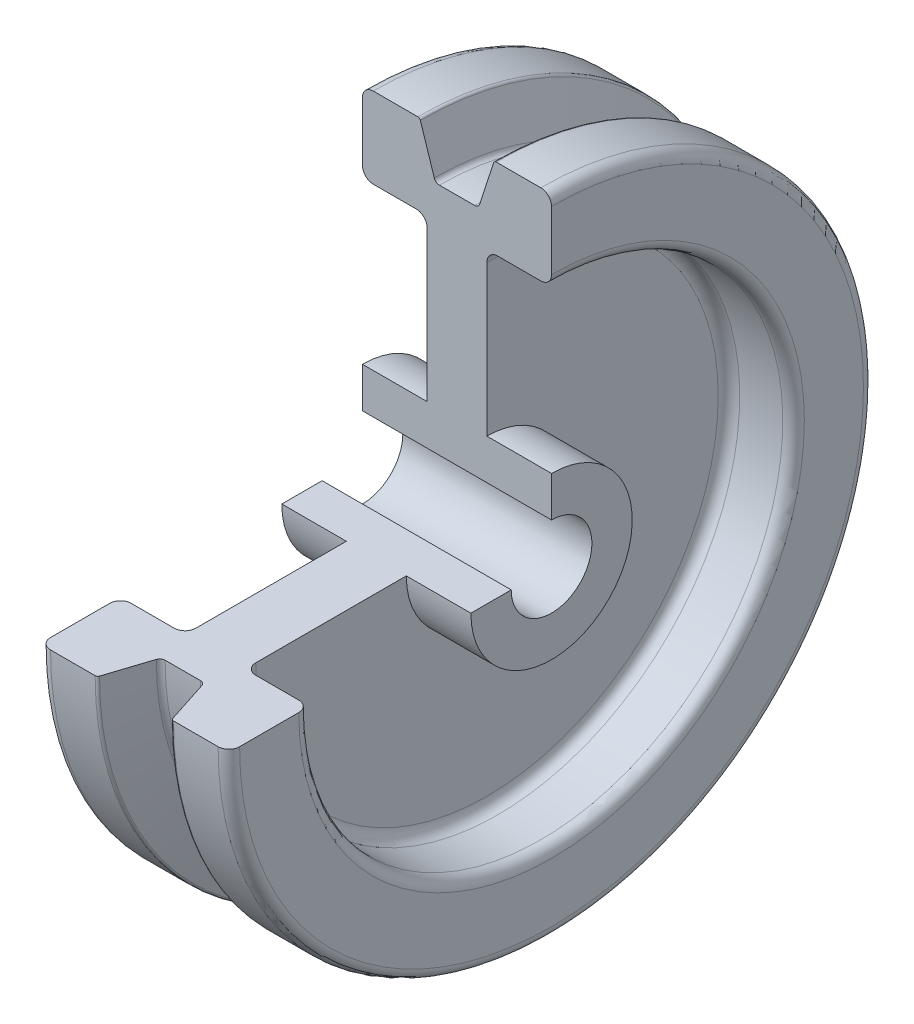
ISO-10303-21;
HEADER;
FILE_DESCRIPTION(('STEP AP214'),'2;1');
FILE_NAME('part.step','',(''),(''),'','','');
FILE_SCHEMA(('AUTOMOTIVE_DESIGN { 1 0 10303 214 1 1 1 1 }'));
ENDSEC;
DATA;
#1=APPLICATION_CONTEXT('core data for automotive mechanical design processes');
#2=APPLICATION_PROTOCOL_DEFINITION('international standard','automotive_design',2000,#1);
#3=PRODUCT_CONTEXT('',#1,'mechanical');
#4=PRODUCT('Part','Part','',(#3));
#5=PRODUCT_RELATED_PRODUCT_CATEGORY('part','',(#4));
#6=PRODUCT_DEFINITION_FORMATION('','',#4);
#7=PRODUCT_DEFINITION_CONTEXT('part definition',#1,'design');
#8=PRODUCT_DEFINITION('design','',#6,#7);
#9=PRODUCT_DEFINITION_SHAPE('','',#8);
#10=(LENGTH_UNIT() NAMED_UNIT(*) SI_UNIT(.MILLI.,.METRE.));
#11=(NAMED_UNIT(*) PLANE_ANGLE_UNIT() SI_UNIT($,.RADIAN.));
#12=(NAMED_UNIT(*) SI_UNIT($,.STERADIAN.) SOLID_ANGLE_UNIT());
#13=UNCERTAINTY_MEASURE_WITH_UNIT(LENGTH_MEASURE(1.E-05),#10,'distance_accuracy_value','');
#14=(GEOMETRIC_REPRESENTATION_CONTEXT(3) GLOBAL_UNCERTAINTY_ASSIGNED_CONTEXT((#13)) GLOBAL_UNIT_ASSIGNED_CONTEXT((#10,
#11,#12)) REPRESENTATION_CONTEXT('',''));
#15=CARTESIAN_POINT('',(0.,0.,0.));
#16=DIRECTION('',(0.,0.,1.));
#17=DIRECTION('',(1.,0.,0.));
#18=AXIS2_PLACEMENT_3D('',#15,#16,#17);
#19=CARTESIAN_POINT('',(-22.8146013448606,0.,0.));
#20=DIRECTION('',(-1.,0.,0.));
#21=DIRECTION('',(0.,0.,1.));
#22=AXIS2_PLACEMENT_3D('',#19,#20,#21);
#23=CYLINDRICAL_SURFACE('',#22,7.5);
#24=DIRECTION('',(-1.,0.,0.));
#25=VECTOR('',#24,1.);
#26=CARTESIAN_POINT('',(-22.8146013448606,7.5,0.));
#27=LINE('',#26,#25);
#28=CARTESIAN_POINT('',(-14.7231594525405,7.5,0.));
#29=VERTEX_POINT('',#28);
#30=CARTESIAN_POINT('',(20.4353419883816,7.50000000000001,0.));
#31=VERTEX_POINT('',#30);
#32=EDGE_CURVE('E349',#29,#31,#27,.F.);
#33=ORIENTED_EDGE('',*,*,#32,.F.);
#34=CARTESIAN_POINT('',(-14.7231594525405,0.,0.));
#35=DIRECTION('',(-1.,0.,0.));
#36=DIRECTION('',(0.,0.,1.));
#37=AXIS2_PLACEMENT_3D('',#34,#35,#36);
#38=CIRCLE('',#37,7.5);
#39=CARTESIAN_POINT('',(-14.7231594525405,0.,7.5));
#40=VERTEX_POINT('',#39);
#41=EDGE_CURVE('E396',#29,#40,#38,.T.);
#42=ORIENTED_EDGE('',*,*,#41,.T.);
#43=DIRECTION('',(-1.,0.,0.));
#44=VECTOR('',#43,1.);
#45=CARTESIAN_POINT('',(-22.8146013448606,0.,7.5));
#46=LINE('',#45,#44);
#47=CARTESIAN_POINT('',(20.4353419883816,0.,7.49999999999999));
#48=VERTEX_POINT('',#47);
#49=EDGE_CURVE('E517',#40,#48,#46,.F.);
#50=ORIENTED_EDGE('',*,*,#49,.T.);
#51=CARTESIAN_POINT('',(20.4353419883816,0.,0.));
#52=DIRECTION('',(-1.,0.,0.));
#53=DIRECTION('',(0.,0.,1.));
#54=AXIS2_PLACEMENT_3D('',#51,#52,#53);
#55=CIRCLE('',#54,7.5);
#56=EDGE_CURVE('E408',#31,#48,#55,.T.);
#57=ORIENTED_EDGE('',*,*,#56,.F.);
#58=EDGE_LOOP('',(#33,#42,#50,#57));
#59=FACE_BOUND('',#58,.T.);
#60=ADVANCED_FACE('F39',(#59),#23,.F.);
#61=CARTESIAN_POINT('',(20.4353419883816,7.5,0.));
#62=DIRECTION('',(-1.,0.,0.));
#63=DIRECTION('',(0.,0.,1.));
#64=AXIS2_PLACEMENT_3D('',#61,#62,#63);
#65=PLANE('',#64);
#66=DIRECTION('',(0.,-1.,0.));
#67=VECTOR('',#66,1.);
#68=CARTESIAN_POINT('',(20.4353419883816,70.,0.));
#69=LINE('',#68,#67);
#70=CARTESIAN_POINT('',(20.4353419883816,15.,0.));
#71=VERTEX_POINT('',#70);
#72=EDGE_CURVE('E237',#71,#31,#69,.T.);
#73=ORIENTED_EDGE('',*,*,#72,.T.);
#74=ORIENTED_EDGE('',*,*,#56,.T.);
#75=DIRECTION('',(0.,0.,-1.));
#76=VECTOR('',#75,1.);
#77=CARTESIAN_POINT('',(20.4353419883816,0.,70.));
#78=LINE('',#77,#76);
#79=CARTESIAN_POINT('',(20.4353419883816,0.,15.));
#80=VERTEX_POINT('',#79);
#81=EDGE_CURVE('E238',#80,#48,#78,.T.);
#82=ORIENTED_EDGE('',*,*,#81,.F.);
#83=CARTESIAN_POINT('',(20.4353419883816,0.,0.));
#84=DIRECTION('',(-1.,0.,0.));
#85=DIRECTION('',(0.,0.,1.));
#86=AXIS2_PLACEMENT_3D('',#83,#84,#85);
#87=CIRCLE('',#86,15.);
#88=EDGE_CURVE('E404',#71,#80,#87,.T.);
#89=ORIENTED_EDGE('',*,*,#88,.F.);
#90=EDGE_LOOP('',(#73,#74,#82,#89));
#91=FACE_BOUND('',#90,.T.);
#92=ADVANCED_FACE('F541',(#91),#65,.F.);
#93=CARTESIAN_POINT('',(-22.8146013448606,0.,0.));
#94=DIRECTION('',(-1.,0.,0.));
#95=DIRECTION('',(0.,0.,1.));
#96=AXIS2_PLACEMENT_3D('',#93,#94,#95);
#97=CYLINDRICAL_SURFACE('',#96,15.);
#98=DIRECTION('',(-1.,0.,0.));
#99=VECTOR('',#98,1.);
#100=CARTESIAN_POINT('',(-22.8146013448606,15.,0.));
#101=LINE('',#100,#99);
#102=CARTESIAN_POINT('',(8.42765707003392,15.,0.));
#103=VERTEX_POINT('',#102);
#104=EDGE_CURVE('E387',#71,#103,#101,.T.);
#105=ORIENTED_EDGE('',*,*,#104,.F.);
#106=ORIENTED_EDGE('',*,*,#88,.T.);
#107=DIRECTION('',(-1.,0.,0.));
#108=VECTOR('',#107,1.);
#109=CARTESIAN_POINT('',(-22.8146013448606,0.,15.));
#110=LINE('',#109,#108);
#111=CARTESIAN_POINT('',(8.42765707003392,0.,15.));
#112=VERTEX_POINT('',#111);
#113=EDGE_CURVE('E485',#80,#112,#110,.T.);
#114=ORIENTED_EDGE('',*,*,#113,.T.);
#115=CARTESIAN_POINT('',(8.42765707003392,0.,0.));
#116=DIRECTION('',(-1.,0.,0.));
#117=DIRECTION('',(0.,0.,1.));
#118=AXIS2_PLACEMENT_3D('',#115,#116,#117);
#119=CIRCLE('',#118,15.);
#120=EDGE_CURVE('E400',#103,#112,#119,.T.);
#121=ORIENTED_EDGE('',*,*,#120,.F.);
#122=EDGE_LOOP('',(#105,#106,#114,#121));
#123=FACE_BOUND('',#122,.T.);
#124=ADVANCED_FACE('F547',(#123),#97,.T.);
#125=CARTESIAN_POINT('',(8.42765707003392,15.,0.));
#126=DIRECTION('',(-1.,0.,0.));
#127=DIRECTION('',(0.,0.,1.));
#128=AXIS2_PLACEMENT_3D('',#125,#126,#127);
#129=PLANE('',#128);
#130=DIRECTION('',(0.,0.,1.));
#131=VECTOR('',#130,1.);
#132=CARTESIAN_POINT('',(8.42765707003392,0.,0.));
#133=LINE('',#132,#131);
#134=CARTESIAN_POINT('',(8.42765707003392,0.,43.));
#135=VERTEX_POINT('',#134);
#136=EDGE_CURVE('E481',#112,#135,#133,.T.);
#137=ORIENTED_EDGE('',*,*,#136,.T.);
#138=CARTESIAN_POINT('',(8.42765707003392,0.,0.));
#139=DIRECTION('',(-1.,0.,0.));
#140=DIRECTION('',(0.,0.,1.));
#141=AXIS2_PLACEMENT_3D('',#138,#139,#140);
#142=CIRCLE('',#141,43.);
#143=CARTESIAN_POINT('',(8.42765707003392,43.,0.));
#144=VERTEX_POINT('',#143);
#145=EDGE_CURVE('E273',#135,#144,#142,.F.);
#146=ORIENTED_EDGE('',*,*,#145,.T.);
#147=DIRECTION('',(0.,1.,0.));
#148=VECTOR('',#147,1.);
#149=CARTESIAN_POINT('',(8.42765707003392,15.,0.));
#150=LINE('',#149,#148);
#151=EDGE_CURVE('E383',#103,#144,#150,.T.);
#152=ORIENTED_EDGE('',*,*,#151,.F.);
#153=ORIENTED_EDGE('',*,*,#120,.T.);
#154=EDGE_LOOP('',(#137,#146,#152,#153));
#155=FACE_BOUND('',#154,.T.);
#156=ADVANCED_FACE('F581',(#155),#129,.F.);
#157=CARTESIAN_POINT('',(-22.8146013448606,0.,0.));
#158=DIRECTION('',(-1.,0.,0.));
#159=DIRECTION('',(0.,0.,1.));
#160=AXIS2_PLACEMENT_3D('',#157,#158,#159);
#161=CYLINDRICAL_SURFACE('',#160,45.);
#162=DIRECTION('',(-1.,0.,0.));
#163=VECTOR('',#162,1.);
#164=CARTESIAN_POINT('',(-22.8146013448606,45.,0.));
#165=LINE('',#164,#163);
#166=CARTESIAN_POINT('',(10.4276570700339,45.,0.));
#167=VERTEX_POINT('',#166);
#168=CARTESIAN_POINT('',(18.4353419883816,45.,0.));
#169=VERTEX_POINT('',#168);
#170=EDGE_CURVE('E380',#167,#169,#165,.F.);
#171=ORIENTED_EDGE('',*,*,#170,.F.);
#172=CARTESIAN_POINT('',(10.4276570700339,0.,0.));
#173=DIRECTION('',(-1.,0.,0.));
#174=DIRECTION('',(0.,0.,1.));
#175=AXIS2_PLACEMENT_3D('',#172,#173,#174);
#176=CIRCLE('',#175,45.);
#177=CARTESIAN_POINT('',(10.4276570700339,0.,45.));
#178=VERTEX_POINT('',#177);
#179=EDGE_CURVE('E269',#167,#178,#176,.T.);
#180=ORIENTED_EDGE('',*,*,#179,.T.);
#181=DIRECTION('',(-1.,0.,0.));
#182=VECTOR('',#181,1.);
#183=CARTESIAN_POINT('',(-22.8146013448606,0.,45.));
#184=LINE('',#183,#182);
#185=CARTESIAN_POINT('',(18.4353419883816,0.,45.));
#186=VERTEX_POINT('',#185);
#187=EDGE_CURVE('E227',#178,#186,#184,.F.);
#188=ORIENTED_EDGE('',*,*,#187,.T.);
#189=CARTESIAN_POINT('',(18.4353419883816,0.,0.));
#190=DIRECTION('',(-1.,0.,0.));
#191=DIRECTION('',(0.,0.,1.));
#192=AXIS2_PLACEMENT_3D('',#189,#190,#191);
#193=CIRCLE('',#192,45.);
#194=EDGE_CURVE('E266',#186,#169,#193,.F.);
#195=ORIENTED_EDGE('',*,*,#194,.T.);
#196=EDGE_LOOP('',(#171,#180,#188,#195));
#197=FACE_BOUND('',#196,.T.);
#198=ADVANCED_FACE('F586',(#197),#161,.F.);
#199=CARTESIAN_POINT('',(20.4353419883816,45.,0.));
#200=DIRECTION('',(-1.,0.,0.));
#201=DIRECTION('',(0.,0.,1.));
#202=AXIS2_PLACEMENT_3D('',#199,#200,#201);
#203=PLANE('',#202);
#204=CARTESIAN_POINT('',(20.4353419883816,58.,0.));
#205=VERTEX_POINT('',#204);
#206=CARTESIAN_POINT('',(20.4353419883816,47.,0.));
#207=VERTEX_POINT('',#206);
#208=EDGE_CURVE('E503',#205,#207,#69,.T.);
#209=ORIENTED_EDGE('',*,*,#208,.T.);
#210=CARTESIAN_POINT('',(20.4353419883816,0.,0.));
#211=DIRECTION('',(-1.,0.,0.));
#212=DIRECTION('',(0.,0.,1.));
#213=AXIS2_PLACEMENT_3D('',#210,#211,#212);
#214=CIRCLE('',#213,47.);
#215=CARTESIAN_POINT('',(20.4353419883816,0.,47.));
#216=VERTEX_POINT('',#215);
#217=EDGE_CURVE('E235',#207,#216,#214,.T.);
#218=ORIENTED_EDGE('',*,*,#217,.T.);
#219=CARTESIAN_POINT('',(20.4353419883816,0.,58.));
#220=VERTEX_POINT('',#219);
#221=EDGE_CURVE('E219',#220,#216,#78,.T.);
#222=ORIENTED_EDGE('',*,*,#221,.F.);
#223=CARTESIAN_POINT('',(20.4353419883816,0.,0.));
#224=DIRECTION('',(-1.,0.,0.));
#225=DIRECTION('',(0.,0.,1.));
#226=AXIS2_PLACEMENT_3D('',#223,#224,#225);
#227=CIRCLE('',#226,58.);
#228=EDGE_CURVE('E233',#220,#205,#227,.F.);
#229=ORIENTED_EDGE('',*,*,#228,.T.);
#230=EDGE_LOOP('',(#209,#218,#222,#229));
#231=FACE_BOUND('',#230,.T.);
#232=ADVANCED_FACE('F232',(#231),#203,.F.);
#233=CARTESIAN_POINT('',(-22.8146013448606,0.,0.));
#234=DIRECTION('',(-1.,0.,0.));
#235=DIRECTION('',(0.,0.,1.));
#236=AXIS2_PLACEMENT_3D('',#233,#234,#235);
#237=CYLINDRICAL_SURFACE('',#236,60.);
#238=DIRECTION('',(-1.,0.,0.));
#239=VECTOR('',#238,1.);
#240=CARTESIAN_POINT('',(-22.8146013448606,60.,0.));
#241=LINE('',#240,#239);
#242=CARTESIAN_POINT('',(18.4353419883816,60.,0.));
#243=VERTEX_POINT('',#242);
#244=CARTESIAN_POINT('',(10.1436397980194,60.,0.));
#245=VERTEX_POINT('',#244);
#246=EDGE_CURVE('E375',#243,#245,#241,.T.);
#247=ORIENTED_EDGE('',*,*,#246,.F.);
#248=CARTESIAN_POINT('',(18.4353419883816,0.,0.));
#249=DIRECTION('',(-1.,0.,0.));
#250=DIRECTION('',(0.,0.,1.));
#251=AXIS2_PLACEMENT_3D('',#248,#249,#250);
#252=CIRCLE('',#251,60.);
#253=CARTESIAN_POINT('',(18.4353419883816,0.,60.));
#254=VERTEX_POINT('',#253);
#255=EDGE_CURVE('E245',#243,#254,#252,.T.);
#256=ORIENTED_EDGE('',*,*,#255,.T.);
#257=DIRECTION('',(-1.,0.,0.));
#258=VECTOR('',#257,1.);
#259=CARTESIAN_POINT('',(-22.8146013448606,0.,60.));
#260=LINE('',#259,#258);
#261=CARTESIAN_POINT('',(10.1436397980194,0.,60.));
#262=VERTEX_POINT('',#261);
#263=EDGE_CURVE('E221',#254,#262,#260,.T.);
#264=ORIENTED_EDGE('',*,*,#263,.T.);
#265=CARTESIAN_POINT('',(10.1436397980194,0.,0.));
#266=DIRECTION('',(1.,0.,0.));
#267=DIRECTION('',(0.,0.,-1.));
#268=AXIS2_PLACEMENT_3D('',#265,#266,#267);
#269=CIRCLE('',#268,60.);
#270=EDGE_CURVE('E416',#262,#245,#269,.T.);
#271=ORIENTED_EDGE('',*,*,#270,.T.);
#272=EDGE_LOOP('',(#247,#256,#264,#271));
#273=FACE_BOUND('',#272,.T.);
#274=ADVANCED_FACE('F607',(#273),#237,.T.);
#275=CARTESIAN_POINT('',(9.78036853401674,0.,0.));
#276=DIRECTION('',(1.,0.,0.));
#277=DIRECTION('',(0.,0.,-1.));
#278=AXIS2_PLACEMENT_3D('',#275,#276,#277);
#279=CONICAL_SURFACE('',#278,60.,1.25663706143592);
#280=DIRECTION('',(-0.309016994374948,-0.951056516295153,0.));
#281=VECTOR('',#280,1.);
#282=CARTESIAN_POINT('',(-9.71481323995767,0.,0.));
#283=LINE('',#282,#281);
#284=CARTESIAN_POINT('',(9.66811153987185,59.6545084971875,0.));
#285=VERTEX_POINT('',#284);
#286=CARTESIAN_POINT('',(7.08060525621038,51.690983005625,0.));
#287=VERTEX_POINT('',#286);
#288=EDGE_CURVE('E368',#285,#287,#283,.T.);
#289=ORIENTED_EDGE('',*,*,#288,.F.);
#290=CARTESIAN_POINT('',(9.66811153987185,0.,0.));
#291=DIRECTION('',(-1.,0.,0.));
#292=DIRECTION('',(0.,0.,1.));
#293=AXIS2_PLACEMENT_3D('',#290,#291,#292);
#294=CIRCLE('',#293,59.6545084971875);
#295=CARTESIAN_POINT('',(9.66811153987185,0.,59.6545084971875));
#296=VERTEX_POINT('',#295);
#297=EDGE_CURVE('E412',#285,#296,#294,.T.);
#298=ORIENTED_EDGE('',*,*,#297,.T.);
#299=DIRECTION('',(-0.309016994374948,0.,-0.951056516295153));
#300=VECTOR('',#299,1.);
#301=CARTESIAN_POINT('',(-9.71481323995767,0.,0.));
#302=LINE('',#301,#300);
#303=CARTESIAN_POINT('',(7.08060525621038,0.,51.690983005625));
#304=VERTEX_POINT('',#303);
#305=EDGE_CURVE('E469',#296,#304,#302,.T.);
#306=ORIENTED_EDGE('',*,*,#305,.T.);
#307=CARTESIAN_POINT('',(7.08060525621038,0.,0.));
#308=DIRECTION('',(1.,0.,0.));
#309=DIRECTION('',(0.,0.,-1.));
#310=AXIS2_PLACEMENT_3D('',#307,#308,#309);
#311=CIRCLE('',#310,51.690983005625);
#312=EDGE_CURVE('E436',#304,#287,#311,.T.);
#313=ORIENTED_EDGE('',*,*,#312,.T.);
#314=EDGE_LOOP('',(#289,#298,#306,#313));
#315=FACE_BOUND('',#314,.T.);
#316=ADVANCED_FACE('F714',(#315),#279,.T.);
#317=CARTESIAN_POINT('',(-22.8146013448606,0.,0.));
#318=DIRECTION('',(-1.,0.,0.));
#319=DIRECTION('',(0.,0.,1.));
#320=AXIS2_PLACEMENT_3D('',#317,#318,#319);
#321=CYLINDRICAL_SURFACE('',#320,51.);
#322=DIRECTION('',(-1.,0.,0.));
#323=VECTOR('',#322,1.);
#324=CARTESIAN_POINT('',(-22.8146013448606,51.,0.));
#325=LINE('',#324,#323);
#326=CARTESIAN_POINT('',(6.12954873991522,51.,0.));
#327=VERTEX_POINT('',#326);
#328=CARTESIAN_POINT('',(-0.417366204074055,51.,0.));
#329=VERTEX_POINT('',#328);
#330=EDGE_CURVE('E362',#327,#329,#325,.T.);
#331=ORIENTED_EDGE('',*,*,#330,.F.);
#332=CARTESIAN_POINT('',(6.12954873991522,0.,0.));
#333=DIRECTION('',(-1.,0.,0.));
#334=DIRECTION('',(0.,0.,1.));
#335=AXIS2_PLACEMENT_3D('',#332,#333,#334);
#336=CIRCLE('',#335,51.);
#337=CARTESIAN_POINT('',(6.12954873991522,0.,51.));
#338=VERTEX_POINT('',#337);
#339=EDGE_CURVE('E432',#327,#338,#336,.T.);
#340=ORIENTED_EDGE('',*,*,#339,.T.);
#341=DIRECTION('',(-1.,0.,0.));
#342=VECTOR('',#341,1.);
#343=CARTESIAN_POINT('',(-22.8146013448606,0.,51.));
#344=LINE('',#343,#342);
#345=CARTESIAN_POINT('',(-0.417366204074055,0.,51.));
#346=VERTEX_POINT('',#345);
#347=EDGE_CURVE('E456',#338,#346,#344,.T.);
#348=ORIENTED_EDGE('',*,*,#347,.T.);
#349=CARTESIAN_POINT('',(-0.417366204074055,0.,0.));
#350=DIRECTION('',(-1.,0.,0.));
#351=DIRECTION('',(0.,0.,1.));
#352=AXIS2_PLACEMENT_3D('',#349,#350,#351);
#353=CIRCLE('',#352,51.);
#354=EDGE_CURVE('E428',#346,#329,#353,.F.);
#355=ORIENTED_EDGE('',*,*,#354,.T.);
#356=EDGE_LOOP('',(#331,#340,#348,#355));
#357=FACE_BOUND('',#356,.T.);
#358=ADVANCED_FACE('F719',(#357),#321,.T.);
#359=CARTESIAN_POINT('',(-14.7231594525405,7.5,0.));
#360=DIRECTION('',(1.,0.,0.));
#361=DIRECTION('',(0.,0.,1.));
#362=AXIS2_PLACEMENT_3D('',#359,#360,#361);
#363=PLANE('',#362);
#364=DIRECTION('',(0.,-1.,0.));
#365=VECTOR('',#364,1.);
#366=CARTESIAN_POINT('',(-14.7231594525405,7.5,0.));
#367=LINE('',#366,#365);
#368=CARTESIAN_POINT('',(-14.7231594525405,15.,0.));
#369=VERTEX_POINT('',#368);
#370=EDGE_CURVE('E341',#369,#29,#367,.T.);
#371=ORIENTED_EDGE('',*,*,#370,.F.);
#372=CARTESIAN_POINT('',(-14.7231594525405,0.,0.));
#373=DIRECTION('',(-1.,0.,0.));
#374=DIRECTION('',(0.,0.,1.));
#375=AXIS2_PLACEMENT_3D('',#372,#373,#374);
#376=CIRCLE('',#375,15.);
#377=CARTESIAN_POINT('',(-14.7231594525405,0.,15.));
#378=VERTEX_POINT('',#377);
#379=EDGE_CURVE('E392',#369,#378,#376,.T.);
#380=ORIENTED_EDGE('',*,*,#379,.T.);
#381=DIRECTION('',(0.,0.,-1.));
#382=VECTOR('',#381,1.);
#383=CARTESIAN_POINT('',(-14.7231594525405,0.,0.));
#384=LINE('',#383,#382);
#385=EDGE_CURVE('E513',#378,#40,#384,.T.);
#386=ORIENTED_EDGE('',*,*,#385,.T.);
#387=ORIENTED_EDGE('',*,*,#41,.F.);
#388=EDGE_LOOP('',(#371,#380,#386,#387));
#389=FACE_BOUND('',#388,.T.);
#390=ADVANCED_FACE('F721',(#389),#363,.F.);
#391=CARTESIAN_POINT('',(28.5267838807018,0.,0.));
#392=DIRECTION('',(1.,0.,0.));
#393=DIRECTION('',(0.,0.,1.));
#394=AXIS2_PLACEMENT_3D('',#391,#392,#393);
#395=CYLINDRICAL_SURFACE('',#394,15.);
#396=DIRECTION('',(1.,0.,0.));
#397=VECTOR('',#396,1.);
#398=CARTESIAN_POINT('',(28.5267838807018,15.,0.));
#399=LINE('',#398,#397);
#400=CARTESIAN_POINT('',(-2.71547453419275,15.,0.));
#401=VERTEX_POINT('',#400);
#402=EDGE_CURVE('E337',#401,#369,#399,.F.);
#403=ORIENTED_EDGE('',*,*,#402,.F.);
#404=CARTESIAN_POINT('',(-2.71547453419275,0.,0.));
#405=DIRECTION('',(-1.,0.,0.));
#406=DIRECTION('',(0.,0.,1.));
#407=AXIS2_PLACEMENT_3D('',#404,#405,#406);
#408=CIRCLE('',#407,15.);
#409=CARTESIAN_POINT('',(-2.71547453419275,0.,15.));
#410=VERTEX_POINT('',#409);
#411=EDGE_CURVE('E335',#401,#410,#408,.T.);
#412=ORIENTED_EDGE('',*,*,#411,.T.);
#413=DIRECTION('',(1.,0.,0.));
#414=VECTOR('',#413,1.);
#415=CARTESIAN_POINT('',(28.5267838807018,0.,15.));
#416=LINE('',#415,#414);
#417=EDGE_CURVE('E509',#410,#378,#416,.F.);
#418=ORIENTED_EDGE('',*,*,#417,.T.);
#419=ORIENTED_EDGE('',*,*,#379,.F.);
#420=EDGE_LOOP('',(#403,#412,#418,#419));
#421=FACE_BOUND('',#420,.T.);
#422=ADVANCED_FACE('F618',(#421),#395,.T.);
#423=CARTESIAN_POINT('',(-2.71547453419275,15.,0.));
#424=DIRECTION('',(1.,0.,0.));
#425=DIRECTION('',(0.,0.,1.));
#426=AXIS2_PLACEMENT_3D('',#423,#424,#425);
#427=PLANE('',#426);
#428=DIRECTION('',(0.,-1.,0.));
#429=VECTOR('',#428,1.);
#430=CARTESIAN_POINT('',(-2.71547453419275,15.,0.));
#431=LINE('',#430,#429);
#432=CARTESIAN_POINT('',(-2.71547453419275,43.,0.));
#433=VERTEX_POINT('',#432);
#434=EDGE_CURVE('E328',#433,#401,#431,.T.);
#435=ORIENTED_EDGE('',*,*,#434,.F.);
#436=CARTESIAN_POINT('',(-2.71547453419275,0.,0.));
#437=DIRECTION('',(1.,0.,0.));
#438=DIRECTION('',(0.,0.,-1.));
#439=AXIS2_PLACEMENT_3D('',#436,#437,#438);
#440=CIRCLE('',#439,43.);
#441=CARTESIAN_POINT('',(-2.71547453419275,0.,43.));
#442=VERTEX_POINT('',#441);
#443=EDGE_CURVE('E276',#433,#442,#440,.F.);
#444=ORIENTED_EDGE('',*,*,#443,.T.);
#445=DIRECTION('',(0.,0.,-1.));
#446=VECTOR('',#445,1.);
#447=CARTESIAN_POINT('',(-2.71547453419275,0.,0.));
#448=LINE('',#447,#446);
#449=EDGE_CURVE('E312',#442,#410,#448,.T.);
#450=ORIENTED_EDGE('',*,*,#449,.T.);
#451=ORIENTED_EDGE('',*,*,#411,.F.);
#452=EDGE_LOOP('',(#435,#444,#450,#451));
#453=FACE_BOUND('',#452,.T.);
#454=ADVANCED_FACE('F333',(#453),#427,.F.);
#455=CARTESIAN_POINT('',(28.5267838807018,0.,0.));
#456=DIRECTION('',(1.,0.,0.));
#457=DIRECTION('',(0.,0.,1.));
#458=AXIS2_PLACEMENT_3D('',#455,#456,#457);
#459=CYLINDRICAL_SURFACE('',#458,45.);
#460=DIRECTION('',(1.,0.,0.));
#461=VECTOR('',#460,1.);
#462=CARTESIAN_POINT('',(28.5267838807018,0.,45.));
#463=LINE('',#462,#461);
#464=CARTESIAN_POINT('',(-12.7231594525405,0.,45.));
#465=VERTEX_POINT('',#464);
#466=CARTESIAN_POINT('',(-4.71547453419275,0.,45.));
#467=VERTEX_POINT('',#466);
#468=EDGE_CURVE('E310',#465,#467,#463,.T.);
#469=ORIENTED_EDGE('',*,*,#468,.T.);
#470=CARTESIAN_POINT('',(-4.71547453419275,0.,0.));
#471=DIRECTION('',(1.,0.,0.));
#472=DIRECTION('',(0.,0.,-1.));
#473=AXIS2_PLACEMENT_3D('',#470,#471,#472);
#474=CIRCLE('',#473,45.);
#475=CARTESIAN_POINT('',(-4.71547453419275,45.,0.));
#476=VERTEX_POINT('',#475);
#477=EDGE_CURVE('E284',#467,#476,#474,.T.);
#478=ORIENTED_EDGE('',*,*,#477,.T.);
#479=DIRECTION('',(1.,0.,0.));
#480=VECTOR('',#479,1.);
#481=CARTESIAN_POINT('',(28.5267838807018,45.,0.));
#482=LINE('',#481,#480);
#483=CARTESIAN_POINT('',(-12.7231594525405,45.,0.));
#484=VERTEX_POINT('',#483);
#485=EDGE_CURVE('E330',#484,#476,#482,.T.);
#486=ORIENTED_EDGE('',*,*,#485,.F.);
#487=CARTESIAN_POINT('',(-12.7231594525405,0.,0.));
#488=DIRECTION('',(1.,0.,0.));
#489=DIRECTION('',(0.,0.,-1.));
#490=AXIS2_PLACEMENT_3D('',#487,#488,#489);
#491=CIRCLE('',#490,45.);
#492=EDGE_CURVE('E280',#484,#465,#491,.F.);
#493=ORIENTED_EDGE('',*,*,#492,.T.);
#494=EDGE_LOOP('',(#469,#478,#486,#493));
#495=FACE_BOUND('',#494,.T.);
#496=ADVANCED_FACE('F317',(#495),#459,.F.);
#497=CARTESIAN_POINT('',(-14.7231594525405,45.,0.));
#498=DIRECTION('',(1.,0.,0.));
#499=DIRECTION('',(0.,0.,1.));
#500=AXIS2_PLACEMENT_3D('',#497,#498,#499);
#501=PLANE('',#500);
#502=DIRECTION('',(0.,0.,-1.));
#503=VECTOR('',#502,1.);
#504=CARTESIAN_POINT('',(-14.7231594525405,0.,0.));
#505=LINE('',#504,#503);
#506=CARTESIAN_POINT('',(-14.7231594525405,0.,58.));
#507=VERTEX_POINT('',#506);
#508=CARTESIAN_POINT('',(-14.7231594525405,0.,47.));
#509=VERTEX_POINT('',#508);
#510=EDGE_CURVE('E322',#507,#509,#505,.T.);
#511=ORIENTED_EDGE('',*,*,#510,.T.);
#512=CARTESIAN_POINT('',(-14.7231594525405,0.,0.));
#513=DIRECTION('',(1.,0.,0.));
#514=DIRECTION('',(0.,0.,-1.));
#515=AXIS2_PLACEMENT_3D('',#512,#513,#514);
#516=CIRCLE('',#515,47.);
#517=CARTESIAN_POINT('',(-14.7231594525405,47.,0.));
#518=VERTEX_POINT('',#517);
#519=EDGE_CURVE('E63',#509,#518,#516,.T.);
#520=ORIENTED_EDGE('',*,*,#519,.T.);
#521=DIRECTION('',(0.,-1.,0.));
#522=VECTOR('',#521,1.);
#523=CARTESIAN_POINT('',(-14.7231594525405,45.,0.));
#524=LINE('',#523,#522);
#525=CARTESIAN_POINT('',(-14.7231594525405,58.,0.));
#526=VERTEX_POINT('',#525);
#527=EDGE_CURVE('E343',#526,#518,#524,.T.);
#528=ORIENTED_EDGE('',*,*,#527,.F.);
#529=CARTESIAN_POINT('',(-14.7231594525405,0.,0.));
#530=DIRECTION('',(1.,0.,0.));
#531=DIRECTION('',(0.,0.,-1.));
#532=AXIS2_PLACEMENT_3D('',#529,#530,#531);
#533=CIRCLE('',#532,58.);
#534=EDGE_CURVE('E244',#526,#507,#533,.F.);
#535=ORIENTED_EDGE('',*,*,#534,.T.);
#536=EDGE_LOOP('',(#511,#520,#528,#535));
#537=FACE_BOUND('',#536,.T.);
#538=ADVANCED_FACE('F497',(#537),#501,.F.);
#539=CARTESIAN_POINT('',(28.5267838807018,0.,0.));
#540=DIRECTION('',(1.,0.,0.));
#541=DIRECTION('',(0.,0.,1.));
#542=AXIS2_PLACEMENT_3D('',#539,#540,#541);
#543=CYLINDRICAL_SURFACE('',#542,60.);
#544=DIRECTION('',(1.,0.,0.));
#545=VECTOR('',#544,1.);
#546=CARTESIAN_POINT('',(28.5267838807018,60.,0.));
#547=LINE('',#546,#545);
#548=CARTESIAN_POINT('',(-4.43145726217825,60.,0.));
#549=VERTEX_POINT('',#548);
#550=CARTESIAN_POINT('',(-12.7231594525405,60.,0.));
#551=VERTEX_POINT('',#550);
#552=EDGE_CURVE('E489',#549,#551,#547,.F.);
#553=ORIENTED_EDGE('',*,*,#552,.F.);
#554=CARTESIAN_POINT('',(-4.43145726217825,0.,0.));
#555=DIRECTION('',(1.,0.,0.));
#556=DIRECTION('',(0.,0.,-1.));
#557=AXIS2_PLACEMENT_3D('',#554,#555,#556);
#558=CIRCLE('',#557,60.);
#559=CARTESIAN_POINT('',(-4.43145726217825,0.,60.));
#560=VERTEX_POINT('',#559);
#561=EDGE_CURVE('E420',#549,#560,#558,.F.);
#562=ORIENTED_EDGE('',*,*,#561,.T.);
#563=DIRECTION('',(1.,0.,0.));
#564=VECTOR('',#563,1.);
#565=CARTESIAN_POINT('',(28.5267838807018,0.,60.));
#566=LINE('',#565,#564);
#567=CARTESIAN_POINT('',(-12.7231594525405,0.,60.));
#568=VERTEX_POINT('',#567);
#569=EDGE_CURVE('E499',#560,#568,#566,.F.);
#570=ORIENTED_EDGE('',*,*,#569,.T.);
#571=CARTESIAN_POINT('',(-12.7231594525405,0.,0.));
#572=DIRECTION('',(1.,0.,0.));
#573=DIRECTION('',(0.,0.,-1.));
#574=AXIS2_PLACEMENT_3D('',#571,#572,#573);
#575=CIRCLE('',#574,60.);
#576=EDGE_CURVE('E250',#568,#551,#575,.T.);
#577=ORIENTED_EDGE('',*,*,#576,.T.);
#578=EDGE_LOOP('',(#553,#562,#570,#577));
#579=FACE_BOUND('',#578,.T.);
#580=ADVANCED_FACE('F527',(#579),#543,.T.);
#581=CARTESIAN_POINT('',(-4.06818599817558,0.,0.));
#582=DIRECTION('',(-1.,0.,0.));
#583=DIRECTION('',(0.,0.,-1.));
#584=AXIS2_PLACEMENT_3D('',#581,#582,#583);
#585=CONICAL_SURFACE('',#584,60.,1.25663706143592);
#586=DIRECTION('',(-0.309016994374948,0.951056516295153,0.));
#587=VECTOR('',#586,1.);
#588=CARTESIAN_POINT('',(15.4269957757988,0.,0.));
#589=LINE('',#588,#587);
#590=CARTESIAN_POINT('',(-1.36842272036922,51.6909830056251,0.));
#591=VERTEX_POINT('',#590);
#592=CARTESIAN_POINT('',(-3.95592900403068,59.6545084971875,0.));
#593=VERTEX_POINT('',#592);
#594=EDGE_CURVE('E356',#591,#593,#589,.T.);
#595=ORIENTED_EDGE('',*,*,#594,.F.);
#596=CARTESIAN_POINT('',(-1.36842272036922,0.,0.));
#597=DIRECTION('',(-1.,0.,0.));
#598=DIRECTION('',(0.,0.,1.));
#599=AXIS2_PLACEMENT_3D('',#596,#597,#598);
#600=CIRCLE('',#599,51.690983005625);
#601=CARTESIAN_POINT('',(-1.36842272036922,0.,51.6909830056251));
#602=VERTEX_POINT('',#601);
#603=EDGE_CURVE('E252',#591,#602,#600,.T.);
#604=ORIENTED_EDGE('',*,*,#603,.T.);
#605=DIRECTION('',(-0.309016994374948,0.,0.951056516295153));
#606=VECTOR('',#605,1.);
#607=CARTESIAN_POINT('',(15.4269957757988,0.,0.));
#608=LINE('',#607,#606);
#609=CARTESIAN_POINT('',(-3.95592900403068,0.,59.6545084971875));
#610=VERTEX_POINT('',#609);
#611=EDGE_CURVE('E446',#602,#610,#608,.T.);
#612=ORIENTED_EDGE('',*,*,#611,.T.);
#613=CARTESIAN_POINT('',(-3.95592900403068,0.,0.));
#614=DIRECTION('',(1.,0.,0.));
#615=DIRECTION('',(0.,0.,-1.));
#616=AXIS2_PLACEMENT_3D('',#613,#614,#615);
#617=CIRCLE('',#616,59.6545084971875);
#618=EDGE_CURVE('E424',#610,#593,#617,.T.);
#619=ORIENTED_EDGE('',*,*,#618,.T.);
#620=EDGE_LOOP('',(#595,#604,#612,#619));
#621=FACE_BOUND('',#620,.T.);
#622=ADVANCED_FACE('F445',(#621),#585,.T.);
#623=CARTESIAN_POINT('',(10.1436397980194,0.,0.));
#624=DIRECTION('',(1.,0.,0.));
#625=DIRECTION('',(0.,0.,-1.));
#626=AXIS2_PLACEMENT_3D('',#623,#624,#625);
#627=TOROIDAL_SURFACE('',#626,59.5,0.5);
#628=ORIENTED_EDGE('',*,*,#297,.F.);
#629=CARTESIAN_POINT('',(10.1436397980194,59.5,0.));
#630=DIRECTION('',(0.,0.,1.));
#631=DIRECTION('',(1.,0.,0.));
#632=AXIS2_PLACEMENT_3D('',#629,#630,#631);
#633=CIRCLE('',#632,0.5);
#634=EDGE_CURVE('E371',#285,#245,#633,.F.);
#635=ORIENTED_EDGE('',*,*,#634,.T.);
#636=ORIENTED_EDGE('',*,*,#270,.F.);
#637=CARTESIAN_POINT('',(10.1436397980194,0.,59.5));
#638=DIRECTION('',(0.,-1.,0.));
#639=DIRECTION('',(0.,0.,-1.));
#640=AXIS2_PLACEMENT_3D('',#637,#638,#639);
#641=CIRCLE('',#640,0.5);
#642=EDGE_CURVE('E473',#296,#262,#641,.F.);
#643=ORIENTED_EDGE('',*,*,#642,.F.);
#644=EDGE_LOOP('',(#628,#635,#636,#643));
#645=FACE_BOUND('',#644,.T.);
#646=ADVANCED_FACE('F553',(#645),#627,.T.);
#647=CARTESIAN_POINT('',(-4.43145726217825,0.,0.));
#648=DIRECTION('',(1.,0.,0.));
#649=DIRECTION('',(0.,0.,-1.));
#650=AXIS2_PLACEMENT_3D('',#647,#648,#649);
#651=TOROIDAL_SURFACE('',#650,59.5,0.5);
#652=ORIENTED_EDGE('',*,*,#561,.F.);
#653=CARTESIAN_POINT('',(-4.43145726217825,59.5,0.));
#654=DIRECTION('',(0.,0.,1.));
#655=DIRECTION('',(1.,0.,0.));
#656=AXIS2_PLACEMENT_3D('',#653,#654,#655);
#657=CIRCLE('',#656,0.5);
#658=EDGE_CURVE('E352',#549,#593,#657,.F.);
#659=ORIENTED_EDGE('',*,*,#658,.T.);
#660=ORIENTED_EDGE('',*,*,#618,.F.);
#661=CARTESIAN_POINT('',(-4.43145726217825,0.,59.5));
#662=DIRECTION('',(0.,-1.,0.));
#663=DIRECTION('',(0.,0.,-1.));
#664=AXIS2_PLACEMENT_3D('',#661,#662,#663);
#665=CIRCLE('',#664,0.5);
#666=EDGE_CURVE('E462',#560,#610,#665,.F.);
#667=ORIENTED_EDGE('',*,*,#666,.F.);
#668=EDGE_LOOP('',(#652,#659,#660,#667));
#669=FACE_BOUND('',#668,.T.);
#670=ADVANCED_FACE('F524',(#669),#651,.T.);
#671=CARTESIAN_POINT('',(6.12954873991522,0.,0.));
#672=DIRECTION('',(-1.,0.,0.));
#673=DIRECTION('',(0.,0.,1.));
#674=AXIS2_PLACEMENT_3D('',#671,#672,#673);
#675=TOROIDAL_SURFACE('',#674,52.,1.);
#676=CARTESIAN_POINT('',(6.12954873991522,52.,0.));
#677=DIRECTION('',(0.,0.,1.));
#678=DIRECTION('',(1.,0.,0.));
#679=AXIS2_PLACEMENT_3D('',#676,#677,#678);
#680=CIRCLE('',#679,1.);
#681=EDGE_CURVE('E365',#287,#327,#680,.F.);
#682=ORIENTED_EDGE('',*,*,#681,.F.);
#683=ORIENTED_EDGE('',*,*,#312,.F.);
#684=CARTESIAN_POINT('',(6.12954873991522,0.,52.));
#685=DIRECTION('',(0.,-1.,0.));
#686=DIRECTION('',(0.,0.,-1.));
#687=AXIS2_PLACEMENT_3D('',#684,#685,#686);
#688=CIRCLE('',#687,1.);
#689=EDGE_CURVE('E460',#304,#338,#688,.F.);
#690=ORIENTED_EDGE('',*,*,#689,.T.);
#691=ORIENTED_EDGE('',*,*,#339,.F.);
#692=EDGE_LOOP('',(#682,#683,#690,#691));
#693=FACE_BOUND('',#692,.T.);
#694=ADVANCED_FACE('F559',(#693),#675,.F.);
#695=CARTESIAN_POINT('',(-0.417366204074055,0.,0.));
#696=DIRECTION('',(-1.,0.,0.));
#697=DIRECTION('',(0.,0.,1.));
#698=AXIS2_PLACEMENT_3D('',#695,#696,#697);
#699=TOROIDAL_SURFACE('',#698,52.,1.);
#700=CARTESIAN_POINT('',(-0.417366204074055,52.,0.));
#701=DIRECTION('',(0.,0.,1.));
#702=DIRECTION('',(1.,0.,0.));
#703=AXIS2_PLACEMENT_3D('',#700,#701,#702);
#704=CIRCLE('',#703,1.);
#705=EDGE_CURVE('E359',#329,#591,#704,.F.);
#706=ORIENTED_EDGE('',*,*,#705,.F.);
#707=ORIENTED_EDGE('',*,*,#354,.F.);
#708=CARTESIAN_POINT('',(-0.417366204074055,0.,52.));
#709=DIRECTION('',(0.,-1.,0.));
#710=DIRECTION('',(0.,0.,-1.));
#711=AXIS2_PLACEMENT_3D('',#708,#709,#710);
#712=CIRCLE('',#711,1.);
#713=EDGE_CURVE('E453',#346,#602,#712,.F.);
#714=ORIENTED_EDGE('',*,*,#713,.T.);
#715=ORIENTED_EDGE('',*,*,#603,.F.);
#716=EDGE_LOOP('',(#706,#707,#714,#715));
#717=FACE_BOUND('',#716,.T.);
#718=ADVANCED_FACE('F451',(#717),#699,.F.);
#719=CARTESIAN_POINT('',(18.4353419883816,0.,0.));
#720=DIRECTION('',(-1.,0.,0.));
#721=DIRECTION('',(0.,0.,1.));
#722=AXIS2_PLACEMENT_3D('',#719,#720,#721);
#723=TOROIDAL_SURFACE('',#722,58.,2.);
#724=ORIENTED_EDGE('',*,*,#255,.F.);
#725=CARTESIAN_POINT('',(18.4353419883816,58.,0.));
#726=DIRECTION('',(0.,0.,1.));
#727=DIRECTION('',(1.,0.,0.));
#728=AXIS2_PLACEMENT_3D('',#725,#726,#727);
#729=CIRCLE('',#728,2.);
#730=EDGE_CURVE('E242',#243,#205,#729,.F.);
#731=ORIENTED_EDGE('',*,*,#730,.T.);
#732=ORIENTED_EDGE('',*,*,#228,.F.);
#733=CARTESIAN_POINT('',(18.4353419883816,0.,58.));
#734=DIRECTION('',(0.,-1.,0.));
#735=DIRECTION('',(0.,0.,-1.));
#736=AXIS2_PLACEMENT_3D('',#733,#734,#735);
#737=CIRCLE('',#736,2.);
#738=EDGE_CURVE('E215',#254,#220,#737,.F.);
#739=ORIENTED_EDGE('',*,*,#738,.F.);
#740=EDGE_LOOP('',(#724,#731,#732,#739));
#741=FACE_BOUND('',#740,.T.);
#742=ADVANCED_FACE('F241',(#741),#723,.T.);
#743=CARTESIAN_POINT('',(-12.7231594525405,0.,0.));
#744=DIRECTION('',(1.,0.,0.));
#745=DIRECTION('',(0.,0.,-1.));
#746=AXIS2_PLACEMENT_3D('',#743,#744,#745);
#747=TOROIDAL_SURFACE('',#746,58.,2.);
#748=ORIENTED_EDGE('',*,*,#534,.F.);
#749=CARTESIAN_POINT('',(-12.7231594525405,58.,0.));
#750=DIRECTION('',(0.,0.,1.));
#751=DIRECTION('',(1.,0.,0.));
#752=AXIS2_PLACEMENT_3D('',#749,#750,#751);
#753=CIRCLE('',#752,2.);
#754=EDGE_CURVE('E262',#526,#551,#753,.F.);
#755=ORIENTED_EDGE('',*,*,#754,.T.);
#756=ORIENTED_EDGE('',*,*,#576,.F.);
#757=CARTESIAN_POINT('',(-12.7231594525405,0.,58.));
#758=DIRECTION('',(0.,-1.,0.));
#759=DIRECTION('',(0.,0.,-1.));
#760=AXIS2_PLACEMENT_3D('',#757,#758,#759);
#761=CIRCLE('',#760,2.);
#762=EDGE_CURVE('E259',#507,#568,#761,.F.);
#763=ORIENTED_EDGE('',*,*,#762,.F.);
#764=EDGE_LOOP('',(#748,#755,#756,#763));
#765=FACE_BOUND('',#764,.T.);
#766=ADVANCED_FACE('F530',(#765),#747,.T.);
#767=CARTESIAN_POINT('',(-19.5646580116184,0.,70.));
#768=DIRECTION('',(0.,-1.,0.));
#769=DIRECTION('',(0.,0.,-1.));
#770=AXIS2_PLACEMENT_3D('',#767,#768,#769);
#771=PLANE('',#770);
#772=ORIENTED_EDGE('',*,*,#468,.F.);
#773=CARTESIAN_POINT('',(-12.7231594525405,0.,47.));
#774=DIRECTION('',(0.,-1.,0.));
#775=DIRECTION('',(0.,0.,-1.));
#776=AXIS2_PLACEMENT_3D('',#773,#774,#775);
#777=CIRCLE('',#776,2.);
#778=EDGE_CURVE('E290',#465,#509,#777,.F.);
#779=ORIENTED_EDGE('',*,*,#778,.T.);
#780=ORIENTED_EDGE('',*,*,#510,.F.);
#781=ORIENTED_EDGE('',*,*,#762,.T.);
#782=ORIENTED_EDGE('',*,*,#569,.F.);
#783=ORIENTED_EDGE('',*,*,#666,.T.);
#784=ORIENTED_EDGE('',*,*,#611,.F.);
#785=ORIENTED_EDGE('',*,*,#713,.F.);
#786=ORIENTED_EDGE('',*,*,#347,.F.);
#787=ORIENTED_EDGE('',*,*,#689,.F.);
#788=ORIENTED_EDGE('',*,*,#305,.F.);
#789=ORIENTED_EDGE('',*,*,#642,.T.);
#790=ORIENTED_EDGE('',*,*,#263,.F.);
#791=ORIENTED_EDGE('',*,*,#738,.T.);
#792=ORIENTED_EDGE('',*,*,#221,.T.);
#793=CARTESIAN_POINT('',(18.4353419883816,0.,47.));
#794=DIRECTION('',(0.,-1.,0.));
#795=DIRECTION('',(0.,0.,-1.));
#796=AXIS2_PLACEMENT_3D('',#793,#794,#795);
#797=CIRCLE('',#796,2.);
#798=EDGE_CURVE('E287',#216,#186,#797,.F.);
#799=ORIENTED_EDGE('',*,*,#798,.T.);
#800=ORIENTED_EDGE('',*,*,#187,.F.);
#801=CARTESIAN_POINT('',(10.4276570700339,0.,43.));
#802=DIRECTION('',(0.,-1.,0.));
#803=DIRECTION('',(0.,0.,-1.));
#804=AXIS2_PLACEMENT_3D('',#801,#802,#803);
#805=CIRCLE('',#804,2.);
#806=EDGE_CURVE('E302',#178,#135,#805,.T.);
#807=ORIENTED_EDGE('',*,*,#806,.T.);
#808=ORIENTED_EDGE('',*,*,#136,.F.);
#809=ORIENTED_EDGE('',*,*,#113,.F.);
#810=ORIENTED_EDGE('',*,*,#81,.T.);
#811=ORIENTED_EDGE('',*,*,#49,.F.);
#812=ORIENTED_EDGE('',*,*,#385,.F.);
#813=ORIENTED_EDGE('',*,*,#417,.F.);
#814=ORIENTED_EDGE('',*,*,#449,.F.);
#815=CARTESIAN_POINT('',(-4.71547453419275,0.,43.));
#816=DIRECTION('',(0.,-1.,0.));
#817=DIRECTION('',(0.,0.,-1.));
#818=AXIS2_PLACEMENT_3D('',#815,#816,#817);
#819=CIRCLE('',#818,2.);
#820=EDGE_CURVE('E48',#442,#467,#819,.T.);
#821=ORIENTED_EDGE('',*,*,#820,.T.);
#822=EDGE_LOOP('',(#772,#779,#780,#781,#782,#783,#784,#785,#786,#787,#788,#789,#790,#791,#792,
#799,#800,#807,#808,#809,#810,#811,#812,#813,#814,#821));
#823=FACE_BOUND('',#822,.T.);
#824=ADVANCED_FACE('F218',(#823),#771,.F.);
#825=CARTESIAN_POINT('',(-19.5646580116184,70.,0.));
#826=DIRECTION('',(0.,0.,1.));
#827=DIRECTION('',(1.,0.,0.));
#828=AXIS2_PLACEMENT_3D('',#825,#826,#827);
#829=PLANE('',#828);
#830=ORIENTED_EDGE('',*,*,#527,.T.);
#831=CARTESIAN_POINT('',(-12.7231594525405,47.,0.));
#832=DIRECTION('',(0.,0.,1.));
#833=DIRECTION('',(1.,0.,0.));
#834=AXIS2_PLACEMENT_3D('',#831,#832,#833);
#835=CIRCLE('',#834,2.);
#836=EDGE_CURVE('E297',#518,#484,#835,.T.);
#837=ORIENTED_EDGE('',*,*,#836,.T.);
#838=ORIENTED_EDGE('',*,*,#485,.T.);
#839=CARTESIAN_POINT('',(-4.71547453419275,43.,0.));
#840=DIRECTION('',(0.,0.,1.));
#841=DIRECTION('',(1.,0.,0.));
#842=AXIS2_PLACEMENT_3D('',#839,#840,#841);
#843=CIRCLE('',#842,2.);
#844=EDGE_CURVE('E11',#476,#433,#843,.F.);
#845=ORIENTED_EDGE('',*,*,#844,.T.);
#846=ORIENTED_EDGE('',*,*,#434,.T.);
#847=ORIENTED_EDGE('',*,*,#402,.T.);
#848=ORIENTED_EDGE('',*,*,#370,.T.);
#849=ORIENTED_EDGE('',*,*,#32,.T.);
#850=ORIENTED_EDGE('',*,*,#72,.F.);
#851=ORIENTED_EDGE('',*,*,#104,.T.);
#852=ORIENTED_EDGE('',*,*,#151,.T.);
#853=CARTESIAN_POINT('',(10.4276570700339,43.,0.));
#854=DIRECTION('',(0.,0.,1.));
#855=DIRECTION('',(1.,0.,0.));
#856=AXIS2_PLACEMENT_3D('',#853,#854,#855);
#857=CIRCLE('',#856,2.);
#858=EDGE_CURVE('E305',#144,#167,#857,.F.);
#859=ORIENTED_EDGE('',*,*,#858,.T.);
#860=ORIENTED_EDGE('',*,*,#170,.T.);
#861=CARTESIAN_POINT('',(18.4353419883816,47.,0.));
#862=DIRECTION('',(0.,0.,1.));
#863=DIRECTION('',(1.,0.,0.));
#864=AXIS2_PLACEMENT_3D('',#861,#862,#863);
#865=CIRCLE('',#864,2.);
#866=EDGE_CURVE('E55',#169,#207,#865,.T.);
#867=ORIENTED_EDGE('',*,*,#866,.T.);
#868=ORIENTED_EDGE('',*,*,#208,.F.);
#869=ORIENTED_EDGE('',*,*,#730,.F.);
#870=ORIENTED_EDGE('',*,*,#246,.T.);
#871=ORIENTED_EDGE('',*,*,#634,.F.);
#872=ORIENTED_EDGE('',*,*,#288,.T.);
#873=ORIENTED_EDGE('',*,*,#681,.T.);
#874=ORIENTED_EDGE('',*,*,#330,.T.);
#875=ORIENTED_EDGE('',*,*,#705,.T.);
#876=ORIENTED_EDGE('',*,*,#594,.T.);
#877=ORIENTED_EDGE('',*,*,#658,.F.);
#878=ORIENTED_EDGE('',*,*,#552,.T.);
#879=ORIENTED_EDGE('',*,*,#754,.F.);
#880=EDGE_LOOP('',(#830,#837,#838,#845,#846,#847,#848,#849,#850,#851,#852,#859,#860,#867,#868,
#869,#870,#871,#872,#873,#874,#875,#876,#877,#878,#879));
#881=FACE_BOUND('',#880,.T.);
#882=ADVANCED_FACE('F327',(#881),#829,.T.);
#883=CARTESIAN_POINT('',(10.4276570700339,0.,0.));
#884=DIRECTION('',(-1.,0.,0.));
#885=DIRECTION('',(0.,0.,1.));
#886=AXIS2_PLACEMENT_3D('',#883,#884,#885);
#887=TOROIDAL_SURFACE('',#886,43.,2.);
#888=ORIENTED_EDGE('',*,*,#858,.F.);
#889=ORIENTED_EDGE('',*,*,#145,.F.);
#890=ORIENTED_EDGE('',*,*,#806,.F.);
#891=ORIENTED_EDGE('',*,*,#179,.F.);
#892=EDGE_LOOP('',(#888,#889,#890,#891));
#893=FACE_BOUND('',#892,.T.);
#894=ADVANCED_FACE('F654',(#893),#887,.F.);
#895=CARTESIAN_POINT('',(-4.71547453419275,0.,0.));
#896=DIRECTION('',(1.,0.,0.));
#897=DIRECTION('',(0.,0.,-1.));
#898=AXIS2_PLACEMENT_3D('',#895,#896,#897);
#899=TOROIDAL_SURFACE('',#898,43.,2.);
#900=ORIENTED_EDGE('',*,*,#844,.F.);
#901=ORIENTED_EDGE('',*,*,#477,.F.);
#902=ORIENTED_EDGE('',*,*,#820,.F.);
#903=ORIENTED_EDGE('',*,*,#443,.F.);
#904=EDGE_LOOP('',(#900,#901,#902,#903));
#905=FACE_BOUND('',#904,.T.);
#906=ADVANCED_FACE('F325',(#905),#899,.F.);
#907=CARTESIAN_POINT('',(-12.7231594525405,0.,0.));
#908=DIRECTION('',(1.,0.,0.));
#909=DIRECTION('',(0.,0.,-1.));
#910=AXIS2_PLACEMENT_3D('',#907,#908,#909);
#911=TOROIDAL_SURFACE('',#910,47.,2.);
#912=ORIENTED_EDGE('',*,*,#836,.F.);
#913=ORIENTED_EDGE('',*,*,#519,.F.);
#914=ORIENTED_EDGE('',*,*,#778,.F.);
#915=ORIENTED_EDGE('',*,*,#492,.F.);
#916=EDGE_LOOP('',(#912,#913,#914,#915));
#917=FACE_BOUND('',#916,.T.);
#918=ADVANCED_FACE('F495',(#917),#911,.T.);
#919=CARTESIAN_POINT('',(18.4353419883816,0.,0.));
#920=DIRECTION('',(-1.,0.,0.));
#921=DIRECTION('',(0.,0.,1.));
#922=AXIS2_PLACEMENT_3D('',#919,#920,#921);
#923=TOROIDAL_SURFACE('',#922,47.,2.);
#924=ORIENTED_EDGE('',*,*,#866,.F.);
#925=ORIENTED_EDGE('',*,*,#194,.F.);
#926=ORIENTED_EDGE('',*,*,#798,.F.);
#927=ORIENTED_EDGE('',*,*,#217,.F.);
#928=EDGE_LOOP('',(#924,#925,#926,#927));
#929=FACE_BOUND('',#928,.T.);
#930=ADVANCED_FACE('F41',(#929),#923,.T.);
#931=CLOSED_SHELL('',(#60,#92,#124,#156,#198,#232,#274,#316,#358,#390,#422,#454,#496,#538,#580,
#622,#646,#670,#694,#718,#742,#766,#824,#882,#894,#906,#918,#930));
#932=MANIFOLD_SOLID_BREP('B2',#931);
#933=ADVANCED_BREP_SHAPE_REPRESENTATION('',(#18,#932),#14);
#934=SHAPE_DEFINITION_REPRESENTATION(#9,#933);
ENDSEC;
END-ISO-10303-21;
